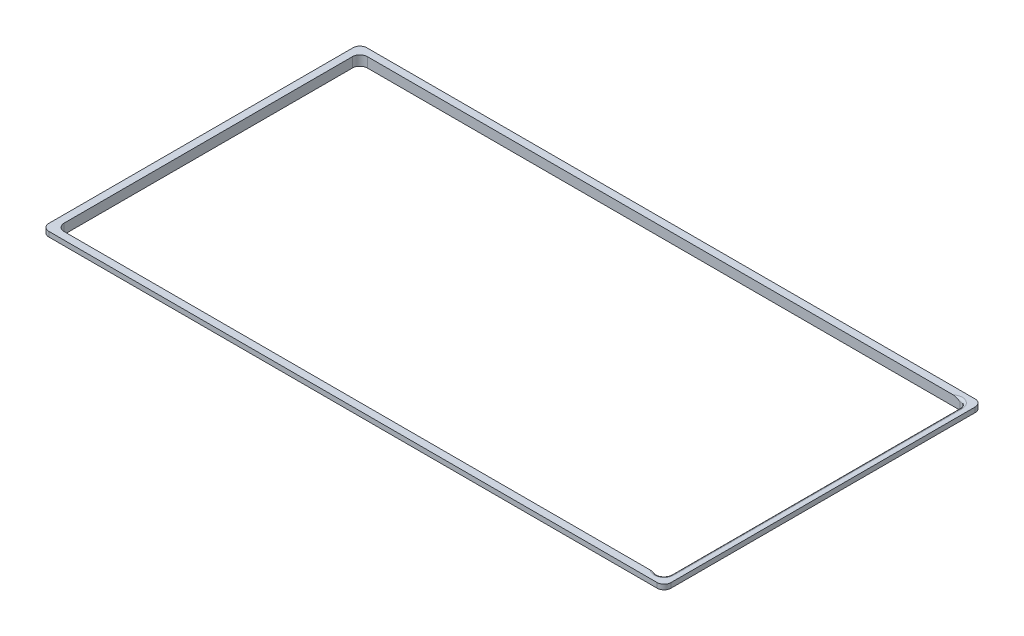
ISO-10303-21;
HEADER;
FILE_DESCRIPTION(('STEP AP214'),'2;1');
FILE_NAME('part.step','',(''),(''),'','','');
FILE_SCHEMA(('AUTOMOTIVE_DESIGN { 1 0 10303 214 1 1 1 1 }'));
ENDSEC;
DATA;
#1=APPLICATION_CONTEXT('core data for automotive mechanical design processes');
#2=APPLICATION_PROTOCOL_DEFINITION('international standard','automotive_design',2000,#1);
#3=PRODUCT_CONTEXT('',#1,'mechanical');
#4=PRODUCT('Part','Part','',(#3));
#5=PRODUCT_RELATED_PRODUCT_CATEGORY('part','',(#4));
#6=PRODUCT_DEFINITION_FORMATION('','',#4);
#7=PRODUCT_DEFINITION_CONTEXT('part definition',#1,'design');
#8=PRODUCT_DEFINITION('design','',#6,#7);
#9=PRODUCT_DEFINITION_SHAPE('','',#8);
#10=(LENGTH_UNIT() NAMED_UNIT(*) SI_UNIT(.MILLI.,.METRE.));
#11=(NAMED_UNIT(*) PLANE_ANGLE_UNIT() SI_UNIT($,.RADIAN.));
#12=(NAMED_UNIT(*) SI_UNIT($,.STERADIAN.) SOLID_ANGLE_UNIT());
#13=UNCERTAINTY_MEASURE_WITH_UNIT(LENGTH_MEASURE(1.E-05),#10,'distance_accuracy_value','');
#14=(GEOMETRIC_REPRESENTATION_CONTEXT(3) GLOBAL_UNCERTAINTY_ASSIGNED_CONTEXT((#13)) GLOBAL_UNIT_ASSIGNED_CONTEXT((#10,
#11,#12)) REPRESENTATION_CONTEXT('',''));
#15=CARTESIAN_POINT('',(0.,0.,0.));
#16=DIRECTION('',(0.,0.,1.));
#17=DIRECTION('',(1.,0.,0.));
#18=AXIS2_PLACEMENT_3D('',#15,#16,#17);
#19=CARTESIAN_POINT('',(249.,0.,3.));
#20=DIRECTION('',(0.,-1.,0.));
#21=DIRECTION('',(0.,0.,-1.));
#22=AXIS2_PLACEMENT_3D('',#19,#20,#21);
#23=PLANE('',#22);
#24=DIRECTION('',(0.,0.,-1.));
#25=VECTOR('',#24,1.);
#26=CARTESIAN_POINT('',(2.2,0.,6.2));
#27=LINE('',#26,#25);
#28=CARTESIAN_POINT('',(2.2,0.,122.8));
#29=VERTEX_POINT('',#28);
#30=CARTESIAN_POINT('',(2.19999999999998,0.,6.2));
#31=VERTEX_POINT('',#30);
#32=EDGE_CURVE('E335',#29,#31,#27,.T.);
#33=ORIENTED_EDGE('',*,*,#32,.F.);
#34=CARTESIAN_POINT('',(6.20000000000001,0.,122.8));
#35=DIRECTION('',(0.,-1.,0.));
#36=DIRECTION('',(0.,0.,-1.));
#37=AXIS2_PLACEMENT_3D('',#34,#35,#36);
#38=CIRCLE('',#37,4.00000000000001);
#39=CARTESIAN_POINT('',(6.20000000000001,0.,126.8));
#40=VERTEX_POINT('',#39);
#41=EDGE_CURVE('E313',#40,#29,#38,.T.);
#42=ORIENTED_EDGE('',*,*,#41,.F.);
#43=DIRECTION('',(-1.,0.,0.));
#44=VECTOR('',#43,1.);
#45=CARTESIAN_POINT('',(6.20000000000001,0.,126.8));
#46=LINE('',#45,#44);
#47=CARTESIAN_POINT('',(245.8,0.,126.8));
#48=VERTEX_POINT('',#47);
#49=EDGE_CURVE('E318',#48,#40,#46,.T.);
#50=ORIENTED_EDGE('',*,*,#49,.F.);
#51=CARTESIAN_POINT('',(245.8,0.,122.8));
#52=DIRECTION('',(0.,-1.,0.));
#53=DIRECTION('',(0.,0.,-1.));
#54=AXIS2_PLACEMENT_3D('',#51,#52,#53);
#55=CIRCLE('',#54,4.);
#56=CARTESIAN_POINT('',(249.8,0.,122.8));
#57=VERTEX_POINT('',#56);
#58=EDGE_CURVE('E345',#57,#48,#55,.T.);
#59=ORIENTED_EDGE('',*,*,#58,.F.);
#60=DIRECTION('',(0.,0.,1.));
#61=VECTOR('',#60,1.);
#62=CARTESIAN_POINT('',(249.8,0.,122.8));
#63=LINE('',#62,#61);
#64=CARTESIAN_POINT('',(249.8,0.,6.2));
#65=VERTEX_POINT('',#64);
#66=EDGE_CURVE('E343',#65,#57,#63,.T.);
#67=ORIENTED_EDGE('',*,*,#66,.F.);
#68=CARTESIAN_POINT('',(245.8,0.,6.2));
#69=DIRECTION('',(0.,-1.,0.));
#70=DIRECTION('',(0.,0.,-1.));
#71=AXIS2_PLACEMENT_3D('',#68,#69,#70);
#72=CIRCLE('',#71,4.00000000000003);
#73=CARTESIAN_POINT('',(245.8,0.,2.19999999999997));
#74=VERTEX_POINT('',#73);
#75=EDGE_CURVE('E341',#74,#65,#72,.T.);
#76=ORIENTED_EDGE('',*,*,#75,.F.);
#77=DIRECTION('',(1.,0.,0.));
#78=VECTOR('',#77,1.);
#79=CARTESIAN_POINT('',(245.8,0.,2.2));
#80=LINE('',#79,#78);
#81=CARTESIAN_POINT('',(6.20000000000001,0.,2.19999999999996));
#82=VERTEX_POINT('',#81);
#83=EDGE_CURVE('E339',#82,#74,#80,.T.);
#84=ORIENTED_EDGE('',*,*,#83,.F.);
#85=CARTESIAN_POINT('',(6.2,0.,6.2));
#86=DIRECTION('',(0.,-1.,0.));
#87=DIRECTION('',(0.,0.,-1.));
#88=AXIS2_PLACEMENT_3D('',#85,#86,#87);
#89=CIRCLE('',#88,4.00000000000002);
#90=EDGE_CURVE('E337',#31,#82,#89,.T.);
#91=ORIENTED_EDGE('',*,*,#90,.F.);
#92=EDGE_LOOP('',(#33,#42,#50,#59,#67,#76,#84,#91));
#93=FACE_BOUND('',#92,.T.);
#94=DIRECTION('',(1.,0.,0.));
#95=VECTOR('',#94,1.);
#96=CARTESIAN_POINT('',(249.,0.,0.2));
#97=LINE('',#96,#95);
#98=CARTESIAN_POINT('',(3.00000000000003,0.,0.2));
#99=VERTEX_POINT('',#98);
#100=CARTESIAN_POINT('',(249.,0.,0.2));
#101=VERTEX_POINT('',#100);
#102=EDGE_CURVE('E259',#99,#101,#97,.T.);
#103=ORIENTED_EDGE('',*,*,#102,.T.);
#104=CARTESIAN_POINT('',(249.,0.,3.));
#105=DIRECTION('',(0.,-1.,0.));
#106=DIRECTION('',(0.,0.,-1.));
#107=AXIS2_PLACEMENT_3D('',#104,#105,#106);
#108=CIRCLE('',#107,2.80000000000001);
#109=CARTESIAN_POINT('',(251.8,0.,3.00000000000002));
#110=VERTEX_POINT('',#109);
#111=EDGE_CURVE('E286',#101,#110,#108,.T.);
#112=ORIENTED_EDGE('',*,*,#111,.T.);
#113=DIRECTION('',(0.,0.,1.));
#114=VECTOR('',#113,1.);
#115=CARTESIAN_POINT('',(251.8,0.,3.));
#116=LINE('',#115,#114);
#117=CARTESIAN_POINT('',(251.8,0.,126.));
#118=VERTEX_POINT('',#117);
#119=EDGE_CURVE('E283',#110,#118,#116,.T.);
#120=ORIENTED_EDGE('',*,*,#119,.T.);
#121=CARTESIAN_POINT('',(249.,0.,126.));
#122=DIRECTION('',(0.,-1.,0.));
#123=DIRECTION('',(0.,0.,-1.));
#124=AXIS2_PLACEMENT_3D('',#121,#122,#123);
#125=CIRCLE('',#124,2.80000000000001);
#126=CARTESIAN_POINT('',(249.,0.,128.8));
#127=VERTEX_POINT('',#126);
#128=EDGE_CURVE('E280',#118,#127,#125,.T.);
#129=ORIENTED_EDGE('',*,*,#128,.T.);
#130=DIRECTION('',(-1.,0.,0.));
#131=VECTOR('',#130,1.);
#132=CARTESIAN_POINT('',(249.,0.,128.8));
#133=LINE('',#132,#131);
#134=CARTESIAN_POINT('',(3.00000000000002,0.,128.8));
#135=VERTEX_POINT('',#134);
#136=EDGE_CURVE('E277',#127,#135,#133,.T.);
#137=ORIENTED_EDGE('',*,*,#136,.T.);
#138=CARTESIAN_POINT('',(3.00000000000002,0.,126.));
#139=DIRECTION('',(0.,-1.,0.));
#140=DIRECTION('',(0.,0.,-1.));
#141=AXIS2_PLACEMENT_3D('',#138,#139,#140);
#142=CIRCLE('',#141,2.80000000000001);
#143=CARTESIAN_POINT('',(0.2,0.,126.));
#144=VERTEX_POINT('',#143);
#145=EDGE_CURVE('E274',#135,#144,#142,.T.);
#146=ORIENTED_EDGE('',*,*,#145,.T.);
#147=DIRECTION('',(0.,0.,-1.));
#148=VECTOR('',#147,1.);
#149=CARTESIAN_POINT('',(0.200000000000006,0.,3.));
#150=LINE('',#149,#148);
#151=CARTESIAN_POINT('',(0.2,0.,3.00000000000002));
#152=VERTEX_POINT('',#151);
#153=EDGE_CURVE('E272',#144,#152,#150,.T.);
#154=ORIENTED_EDGE('',*,*,#153,.T.);
#155=CARTESIAN_POINT('',(3.,0.,3.));
#156=DIRECTION('',(0.,-1.,0.));
#157=DIRECTION('',(0.,0.,-1.));
#158=AXIS2_PLACEMENT_3D('',#155,#156,#157);
#159=CIRCLE('',#158,2.8);
#160=EDGE_CURVE('E221',#152,#99,#159,.T.);
#161=ORIENTED_EDGE('',*,*,#160,.T.);
#162=EDGE_LOOP('',(#103,#112,#120,#129,#137,#146,#154,#161));
#163=FACE_BOUND('',#162,.T.);
#164=ADVANCED_FACE('F39',(#93,#163),#23,.T.);
#165=CARTESIAN_POINT('',(249.,2.,3.));
#166=DIRECTION('',(0.,-1.,0.));
#167=DIRECTION('',(0.,0.,-1.));
#168=AXIS2_PLACEMENT_3D('',#165,#166,#167);
#169=PLANE('',#168);
#170=DIRECTION('',(-1.,0.,0.));
#171=VECTOR('',#170,1.);
#172=CARTESIAN_POINT('',(6.2,2.,3.2));
#173=LINE('',#172,#171);
#174=CARTESIAN_POINT('',(243.154248688935,2.,3.2));
#175=VERTEX_POINT('',#174);
#176=CARTESIAN_POINT('',(6.2,2.,3.2));
#177=VERTEX_POINT('',#176);
#178=EDGE_CURVE('E370',#175,#177,#173,.T.);
#179=ORIENTED_EDGE('',*,*,#178,.F.);
#180=CARTESIAN_POINT('',(245.8,2.,6.2));
#181=DIRECTION('',(0.,-1.,0.));
#182=DIRECTION('',(0.,0.,-1.));
#183=AXIS2_PLACEMENT_3D('',#180,#181,#182);
#184=CIRCLE('',#183,4.);
#185=CARTESIAN_POINT('',(249.8,2.,6.2));
#186=VERTEX_POINT('',#185);
#187=EDGE_CURVE('E516',#175,#186,#184,.T.);
#188=ORIENTED_EDGE('',*,*,#187,.T.);
#189=DIRECTION('',(0.,0.,-1.));
#190=VECTOR('',#189,1.);
#191=CARTESIAN_POINT('',(249.8,2.,122.8));
#192=LINE('',#191,#190);
#193=CARTESIAN_POINT('',(249.8,2.,122.8));
#194=VERTEX_POINT('',#193);
#195=EDGE_CURVE('E407',#186,#194,#192,.F.);
#196=ORIENTED_EDGE('',*,*,#195,.T.);
#197=CARTESIAN_POINT('',(245.8,2.,122.8));
#198=DIRECTION('',(0.,-1.,0.));
#199=DIRECTION('',(0.,0.,-1.));
#200=AXIS2_PLACEMENT_3D('',#197,#198,#199);
#201=CIRCLE('',#200,4.00000000000002);
#202=CARTESIAN_POINT('',(243.154248688935,2.,125.8));
#203=VERTEX_POINT('',#202);
#204=EDGE_CURVE('E517',#194,#203,#201,.T.);
#205=ORIENTED_EDGE('',*,*,#204,.T.);
#206=DIRECTION('',(1.,0.,0.));
#207=VECTOR('',#206,1.);
#208=CARTESIAN_POINT('',(6.20000000000001,2.,125.8));
#209=LINE('',#208,#207);
#210=CARTESIAN_POINT('',(6.20000000000001,2.,125.8));
#211=VERTEX_POINT('',#210);
#212=EDGE_CURVE('E378',#211,#203,#209,.T.);
#213=ORIENTED_EDGE('',*,*,#212,.F.);
#214=CARTESIAN_POINT('',(6.20000000000001,2.,122.8));
#215=DIRECTION('',(0.,1.,0.));
#216=DIRECTION('',(0.,0.,-1.));
#217=AXIS2_PLACEMENT_3D('',#214,#215,#216);
#218=CIRCLE('',#217,3.);
#219=CARTESIAN_POINT('',(3.20000000000001,2.,122.8));
#220=VERTEX_POINT('',#219);
#221=EDGE_CURVE('E376',#220,#211,#218,.T.);
#222=ORIENTED_EDGE('',*,*,#221,.F.);
#223=DIRECTION('',(0.,0.,1.));
#224=VECTOR('',#223,1.);
#225=CARTESIAN_POINT('',(3.2,2.,6.2));
#226=LINE('',#225,#224);
#227=CARTESIAN_POINT('',(3.2,2.,6.2));
#228=VERTEX_POINT('',#227);
#229=EDGE_CURVE('E374',#228,#220,#226,.T.);
#230=ORIENTED_EDGE('',*,*,#229,.F.);
#231=CARTESIAN_POINT('',(6.2,2.,6.2));
#232=DIRECTION('',(0.,1.,0.));
#233=DIRECTION('',(0.,0.,1.));
#234=AXIS2_PLACEMENT_3D('',#231,#232,#233);
#235=CIRCLE('',#234,3.);
#236=EDGE_CURVE('E372',#177,#228,#235,.T.);
#237=ORIENTED_EDGE('',*,*,#236,.F.);
#238=EDGE_LOOP('',(#179,#188,#196,#205,#213,#222,#230,#237));
#239=FACE_BOUND('',#238,.T.);
#240=CARTESIAN_POINT('',(249.,2.,3.));
#241=DIRECTION('',(0.,1.,0.));
#242=DIRECTION('',(0.,0.,1.));
#243=AXIS2_PLACEMENT_3D('',#240,#241,#242);
#244=CIRCLE('',#243,2.80000000000001);
#245=CARTESIAN_POINT('',(251.8,2.,3.00000000000002));
#246=VERTEX_POINT('',#245);
#247=CARTESIAN_POINT('',(249.,2.,0.2));
#248=VERTEX_POINT('',#247);
#249=EDGE_CURVE('E242',#246,#248,#244,.T.);
#250=ORIENTED_EDGE('',*,*,#249,.T.);
#251=DIRECTION('',(-1.,0.,0.));
#252=VECTOR('',#251,1.);
#253=CARTESIAN_POINT('',(249.,2.,0.2));
#254=LINE('',#253,#252);
#255=CARTESIAN_POINT('',(3.00000000000003,2.,0.2));
#256=VERTEX_POINT('',#255);
#257=EDGE_CURVE('E240',#248,#256,#254,.T.);
#258=ORIENTED_EDGE('',*,*,#257,.T.);
#259=CARTESIAN_POINT('',(3.,2.,3.));
#260=DIRECTION('',(0.,1.,0.));
#261=DIRECTION('',(0.,0.,1.));
#262=AXIS2_PLACEMENT_3D('',#259,#260,#261);
#263=CIRCLE('',#262,2.8);
#264=CARTESIAN_POINT('',(0.2,2.,3.00000000000002));
#265=VERTEX_POINT('',#264);
#266=EDGE_CURVE('E218',#256,#265,#263,.T.);
#267=ORIENTED_EDGE('',*,*,#266,.T.);
#268=DIRECTION('',(0.,0.,1.));
#269=VECTOR('',#268,1.);
#270=CARTESIAN_POINT('',(0.200000000000001,2.,3.00000000000002));
#271=LINE('',#270,#269);
#272=CARTESIAN_POINT('',(0.2,2.,126.));
#273=VERTEX_POINT('',#272);
#274=EDGE_CURVE('E228',#265,#273,#271,.T.);
#275=ORIENTED_EDGE('',*,*,#274,.T.);
#276=CARTESIAN_POINT('',(3.00000000000002,2.,126.));
#277=DIRECTION('',(0.,1.,0.));
#278=DIRECTION('',(0.,0.,1.));
#279=AXIS2_PLACEMENT_3D('',#276,#277,#278);
#280=CIRCLE('',#279,2.80000000000001);
#281=CARTESIAN_POINT('',(3.00000000000002,2.,128.8));
#282=VERTEX_POINT('',#281);
#283=EDGE_CURVE('E234',#273,#282,#280,.T.);
#284=ORIENTED_EDGE('',*,*,#283,.T.);
#285=DIRECTION('',(1.,0.,0.));
#286=VECTOR('',#285,1.);
#287=CARTESIAN_POINT('',(3.00000000000001,2.,128.8));
#288=LINE('',#287,#286);
#289=CARTESIAN_POINT('',(249.,2.,128.8));
#290=VERTEX_POINT('',#289);
#291=EDGE_CURVE('E247',#282,#290,#288,.T.);
#292=ORIENTED_EDGE('',*,*,#291,.T.);
#293=CARTESIAN_POINT('',(249.,2.,126.));
#294=DIRECTION('',(0.,1.,0.));
#295=DIRECTION('',(0.,0.,1.));
#296=AXIS2_PLACEMENT_3D('',#293,#294,#295);
#297=CIRCLE('',#296,2.80000000000001);
#298=CARTESIAN_POINT('',(251.8,2.,126.));
#299=VERTEX_POINT('',#298);
#300=EDGE_CURVE('E250',#290,#299,#297,.T.);
#301=ORIENTED_EDGE('',*,*,#300,.T.);
#302=DIRECTION('',(0.,0.,-1.));
#303=VECTOR('',#302,1.);
#304=CARTESIAN_POINT('',(251.8,2.,126.));
#305=LINE('',#304,#303);
#306=EDGE_CURVE('E253',#299,#246,#305,.T.);
#307=ORIENTED_EDGE('',*,*,#306,.T.);
#308=EDGE_LOOP('',(#250,#258,#267,#275,#284,#292,#301,#307));
#309=FACE_BOUND('',#308,.T.);
#310=ADVANCED_FACE('F238',(#239,#309),#169,.F.);
#311=CARTESIAN_POINT('',(245.8,2.,6.2));
#312=DIRECTION('',(0.,-1.,0.));
#313=DIRECTION('',(0.,0.,-1.));
#314=AXIS2_PLACEMENT_3D('',#311,#312,#313);
#315=CYLINDRICAL_SURFACE('',#314,3.);
#316=DIRECTION('',(0.,-1.,0.));
#317=VECTOR('',#316,1.);
#318=CARTESIAN_POINT('',(248.8,2.,6.2));
#319=LINE('',#318,#317);
#320=CARTESIAN_POINT('',(248.8,1.,6.2));
#321=VERTEX_POINT('',#320);
#322=CARTESIAN_POINT('',(248.8,-2.,6.2));
#323=VERTEX_POINT('',#322);
#324=EDGE_CURVE('E380',#321,#323,#319,.T.);
#325=ORIENTED_EDGE('',*,*,#324,.F.);
#326=CARTESIAN_POINT('',(245.8,1.,6.2));
#327=DIRECTION('',(0.,-1.,0.));
#328=DIRECTION('',(0.,0.,-1.));
#329=AXIS2_PLACEMENT_3D('',#326,#327,#328);
#330=CIRCLE('',#329,3.);
#331=CARTESIAN_POINT('',(245.8,1.,3.2));
#332=VERTEX_POINT('',#331);
#333=EDGE_CURVE('E396',#321,#332,#330,.F.);
#334=ORIENTED_EDGE('',*,*,#333,.T.);
#335=DIRECTION('',(0.,-1.,0.));
#336=VECTOR('',#335,1.);
#337=CARTESIAN_POINT('',(245.8,2.,3.2));
#338=LINE('',#337,#336);
#339=CARTESIAN_POINT('',(245.8,-2.,3.2));
#340=VERTEX_POINT('',#339);
#341=EDGE_CURVE('E394',#332,#340,#338,.T.);
#342=ORIENTED_EDGE('',*,*,#341,.T.);
#343=CARTESIAN_POINT('',(245.8,-2.,6.2));
#344=DIRECTION('',(0.,-1.,0.));
#345=DIRECTION('',(0.,0.,-1.));
#346=AXIS2_PLACEMENT_3D('',#343,#344,#345);
#347=CIRCLE('',#346,3.);
#348=EDGE_CURVE('E307',#340,#323,#347,.T.);
#349=ORIENTED_EDGE('',*,*,#348,.T.);
#350=EDGE_LOOP('',(#325,#334,#342,#349));
#351=FACE_BOUND('',#350,.T.);
#352=ADVANCED_FACE('F418',(#351),#315,.F.);
#353=CARTESIAN_POINT('',(6.2,2.,3.2));
#354=DIRECTION('',(0.,0.,1.));
#355=DIRECTION('',(1.,0.,0.));
#356=AXIS2_PLACEMENT_3D('',#353,#354,#355);
#357=PLANE('',#356);
#358=ORIENTED_EDGE('',*,*,#341,.F.);
#359=CARTESIAN_POINT('',(243.154248688935,2.,3.2));
#360=CARTESIAN_POINT('',(243.229838055169,1.99998056944619,3.2));
#361=CARTESIAN_POINT('',(243.305324759837,1.99625474070306,3.2));
#362=CARTESIAN_POINT('',(243.455551913194,1.98235127968281,3.2));
#363=CARTESIAN_POINT('',(243.530293612384,1.97218745926706,3.2));
#364=CARTESIAN_POINT('',(243.750920038087,1.93382268301607,3.2));
#365=CARTESIAN_POINT('',(243.895419127168,1.89769044288574,3.2));
#366=CARTESIAN_POINT('',(244.192257965878,1.80602822582356,3.2));
#367=CARTESIAN_POINT('',(244.344123020857,1.74903813086173,3.2));
#368=CARTESIAN_POINT('',(244.642610574791,1.62253993387655,3.2));
#369=CARTESIAN_POINT('',(244.78922683472,1.55301749103933,3.2));
#370=CARTESIAN_POINT('',(245.224920399901,1.33195362115618,3.2));
#371=CARTESIAN_POINT('',(245.50785237038,1.16867076080264,3.20000000000001));
#372=CARTESIAN_POINT('',(245.793675467035,1.00365145152839,3.2));
#373=CARTESIAN_POINT('',(245.796837744966,1.00182570919886,3.2));
#374=CARTESIAN_POINT('',(245.8,1.,3.2));
#375=B_SPLINE_CURVE_WITH_KNOTS('',3,(#359,#360,#361,#362,#363,#364,#365,#366,#367,#368,#369,
#370,#371,#372,#373,#374),.UNSPECIFIED.,.F.,.F.,(4,2,2,2,2,2,2,4),(0.,0.226523097183641,
0.452561857357622,0.898071970071568,1.38391997806556,1.87032751436373,2.84948260162621,
2.86043705277646),.UNSPECIFIED.);
#376=EDGE_CURVE('E399',#332,#175,#375,.F.);
#377=ORIENTED_EDGE('',*,*,#376,.T.);
#378=ORIENTED_EDGE('',*,*,#178,.T.);
#379=DIRECTION('',(0.,-1.,0.));
#380=VECTOR('',#379,1.);
#381=CARTESIAN_POINT('',(6.2,2.,3.2));
#382=LINE('',#381,#380);
#383=CARTESIAN_POINT('',(6.2,-2.,3.2));
#384=VERTEX_POINT('',#383);
#385=EDGE_CURVE('E392',#177,#384,#382,.T.);
#386=ORIENTED_EDGE('',*,*,#385,.T.);
#387=DIRECTION('',(1.,0.,0.));
#388=VECTOR('',#387,1.);
#389=CARTESIAN_POINT('',(245.8,-2.,3.2));
#390=LINE('',#389,#388);
#391=EDGE_CURVE('E304',#384,#340,#390,.T.);
#392=ORIENTED_EDGE('',*,*,#391,.T.);
#393=EDGE_LOOP('',(#358,#377,#378,#386,#392));
#394=FACE_BOUND('',#393,.T.);
#395=ADVANCED_FACE('F412',(#394),#357,.T.);
#396=CARTESIAN_POINT('',(6.2,2.,6.2));
#397=DIRECTION('',(0.,-1.,0.));
#398=DIRECTION('',(0.,0.,-1.));
#399=AXIS2_PLACEMENT_3D('',#396,#397,#398);
#400=CYLINDRICAL_SURFACE('',#399,3.);
#401=DIRECTION('',(0.,-1.,0.));
#402=VECTOR('',#401,1.);
#403=CARTESIAN_POINT('',(3.2,2.,6.2));
#404=LINE('',#403,#402);
#405=CARTESIAN_POINT('',(3.2,-2.,6.2));
#406=VERTEX_POINT('',#405);
#407=EDGE_CURVE('E390',#228,#406,#404,.T.);
#408=ORIENTED_EDGE('',*,*,#407,.T.);
#409=CARTESIAN_POINT('',(6.2,-2.,6.2));
#410=DIRECTION('',(0.,-1.,0.));
#411=DIRECTION('',(0.,0.,-1.));
#412=AXIS2_PLACEMENT_3D('',#409,#410,#411);
#413=CIRCLE('',#412,3.);
#414=EDGE_CURVE('E301',#406,#384,#413,.T.);
#415=ORIENTED_EDGE('',*,*,#414,.T.);
#416=ORIENTED_EDGE('',*,*,#385,.F.);
#417=ORIENTED_EDGE('',*,*,#236,.T.);
#418=EDGE_LOOP('',(#408,#415,#416,#417));
#419=FACE_BOUND('',#418,.T.);
#420=ADVANCED_FACE('F417',(#419),#400,.F.);
#421=CARTESIAN_POINT('',(3.2,2.,6.2));
#422=DIRECTION('',(1.,0.,0.));
#423=DIRECTION('',(0.,0.,-1.));
#424=AXIS2_PLACEMENT_3D('',#421,#422,#423);
#425=PLANE('',#424);
#426=DIRECTION('',(0.,-1.,0.));
#427=VECTOR('',#426,1.);
#428=CARTESIAN_POINT('',(3.20000000000001,2.,122.8));
#429=LINE('',#428,#427);
#430=CARTESIAN_POINT('',(3.20000000000001,-2.,122.8));
#431=VERTEX_POINT('',#430);
#432=EDGE_CURVE('E388',#220,#431,#429,.T.);
#433=ORIENTED_EDGE('',*,*,#432,.T.);
#434=DIRECTION('',(0.,0.,-1.));
#435=VECTOR('',#434,1.);
#436=CARTESIAN_POINT('',(3.2,-2.,6.2));
#437=LINE('',#436,#435);
#438=EDGE_CURVE('E298',#431,#406,#437,.T.);
#439=ORIENTED_EDGE('',*,*,#438,.T.);
#440=ORIENTED_EDGE('',*,*,#407,.F.);
#441=ORIENTED_EDGE('',*,*,#229,.T.);
#442=EDGE_LOOP('',(#433,#439,#440,#441));
#443=FACE_BOUND('',#442,.T.);
#444=ADVANCED_FACE('F485',(#443),#425,.T.);
#445=CARTESIAN_POINT('',(6.20000000000001,2.,122.8));
#446=DIRECTION('',(0.,-1.,0.));
#447=DIRECTION('',(0.,0.,-1.));
#448=AXIS2_PLACEMENT_3D('',#445,#446,#447);
#449=CYLINDRICAL_SURFACE('',#448,3.);
#450=DIRECTION('',(0.,-1.,0.));
#451=VECTOR('',#450,1.);
#452=CARTESIAN_POINT('',(6.20000000000001,2.,125.8));
#453=LINE('',#452,#451);
#454=CARTESIAN_POINT('',(6.20000000000001,-2.,125.8));
#455=VERTEX_POINT('',#454);
#456=EDGE_CURVE('E386',#211,#455,#453,.T.);
#457=ORIENTED_EDGE('',*,*,#456,.T.);
#458=CARTESIAN_POINT('',(6.20000000000001,-2.,122.8));
#459=DIRECTION('',(0.,-1.,0.));
#460=DIRECTION('',(0.,0.,-1.));
#461=AXIS2_PLACEMENT_3D('',#458,#459,#460);
#462=CIRCLE('',#461,3.);
#463=EDGE_CURVE('E295',#455,#431,#462,.T.);
#464=ORIENTED_EDGE('',*,*,#463,.T.);
#465=ORIENTED_EDGE('',*,*,#432,.F.);
#466=ORIENTED_EDGE('',*,*,#221,.T.);
#467=EDGE_LOOP('',(#457,#464,#465,#466));
#468=FACE_BOUND('',#467,.T.);
#469=ADVANCED_FACE('F482',(#468),#449,.F.);
#470=CARTESIAN_POINT('',(6.20000000000001,2.,125.8));
#471=DIRECTION('',(0.,0.,-1.));
#472=DIRECTION('',(-1.,0.,0.));
#473=AXIS2_PLACEMENT_3D('',#470,#471,#472);
#474=PLANE('',#473);
#475=ORIENTED_EDGE('',*,*,#212,.T.);
#476=CARTESIAN_POINT('',(243.154248688935,2.,125.8));
#477=CARTESIAN_POINT('',(243.22983805517,1.99998056944622,125.8));
#478=CARTESIAN_POINT('',(243.305324759839,1.99625474070298,125.8));
#479=CARTESIAN_POINT('',(243.455551913198,1.98235127968237,125.8));
#480=CARTESIAN_POINT('',(243.530293612388,1.9721874592664,125.8));
#481=CARTESIAN_POINT('',(243.75092003809,1.93382268301529,125.8));
#482=CARTESIAN_POINT('',(243.89541912717,1.89769044288551,125.8));
#483=CARTESIAN_POINT('',(244.192257965877,1.80602822582334,125.8));
#484=CARTESIAN_POINT('',(244.344123020856,1.74903813086072,125.8));
#485=CARTESIAN_POINT('',(244.64261057479,1.62253993387839,125.8));
#486=CARTESIAN_POINT('',(244.789226834721,1.55301749104486,125.8));
#487=CARTESIAN_POINT('',(245.224920399894,1.33195362114816,125.8));
#488=CARTESIAN_POINT('',(245.50785237035,1.16867076075337,125.8));
#489=CARTESIAN_POINT('',(245.793675467034,1.00365145152726,125.8));
#490=CARTESIAN_POINT('',(245.796837744966,1.00182570919828,125.8));
#491=CARTESIAN_POINT('',(245.8,1.,125.8));
#492=B_SPLINE_CURVE_WITH_KNOTS('',3,(#476,#477,#478,#479,#480,#481,#482,#483,#484,#485,#486,
#487,#488,#489,#490,#491),.UNSPECIFIED.,.F.,.F.,(4,2,2,2,2,2,2,4),(0.,0.226523097186592,
0.452561857362801,0.898071970071575,1.38391997806476,1.87032751436056,2.84948260162628,
2.86043705277645),.UNSPECIFIED.);
#493=CARTESIAN_POINT('',(245.8,1.,125.8));
#494=VERTEX_POINT('',#493);
#495=EDGE_CURVE('E49',#203,#494,#492,.T.);
#496=ORIENTED_EDGE('',*,*,#495,.T.);
#497=DIRECTION('',(0.,-1.,0.));
#498=VECTOR('',#497,1.);
#499=CARTESIAN_POINT('',(245.8,2.,125.8));
#500=LINE('',#499,#498);
#501=CARTESIAN_POINT('',(245.8,-2.,125.8));
#502=VERTEX_POINT('',#501);
#503=EDGE_CURVE('E384',#494,#502,#500,.T.);
#504=ORIENTED_EDGE('',*,*,#503,.T.);
#505=DIRECTION('',(-1.,0.,0.));
#506=VECTOR('',#505,1.);
#507=CARTESIAN_POINT('',(6.20000000000001,-2.,125.8));
#508=LINE('',#507,#506);
#509=EDGE_CURVE('E292',#502,#455,#508,.T.);
#510=ORIENTED_EDGE('',*,*,#509,.T.);
#511=ORIENTED_EDGE('',*,*,#456,.F.);
#512=EDGE_LOOP('',(#475,#496,#504,#510,#511));
#513=FACE_BOUND('',#512,.T.);
#514=ADVANCED_FACE('F476',(#513),#474,.T.);
#515=CARTESIAN_POINT('',(245.8,2.,122.8));
#516=DIRECTION('',(0.,-1.,0.));
#517=DIRECTION('',(0.,0.,-1.));
#518=AXIS2_PLACEMENT_3D('',#515,#516,#517);
#519=CYLINDRICAL_SURFACE('',#518,3.00000000000002);
#520=ORIENTED_EDGE('',*,*,#503,.F.);
#521=CARTESIAN_POINT('',(245.8,1.,122.8));
#522=DIRECTION('',(0.,-1.,0.));
#523=DIRECTION('',(0.,0.,-1.));
#524=AXIS2_PLACEMENT_3D('',#521,#522,#523);
#525=CIRCLE('',#524,3.00000000000002);
#526=CARTESIAN_POINT('',(248.8,1.,122.8));
#527=VERTEX_POINT('',#526);
#528=EDGE_CURVE('E63',#494,#527,#525,.F.);
#529=ORIENTED_EDGE('',*,*,#528,.T.);
#530=DIRECTION('',(0.,-1.,0.));
#531=VECTOR('',#530,1.);
#532=CARTESIAN_POINT('',(248.8,2.,122.8));
#533=LINE('',#532,#531);
#534=CARTESIAN_POINT('',(248.8,-2.,122.8));
#535=VERTEX_POINT('',#534);
#536=EDGE_CURVE('E382',#527,#535,#533,.T.);
#537=ORIENTED_EDGE('',*,*,#536,.T.);
#538=CARTESIAN_POINT('',(245.8,-2.,122.8));
#539=DIRECTION('',(0.,-1.,0.));
#540=DIRECTION('',(0.,0.,-1.));
#541=AXIS2_PLACEMENT_3D('',#538,#539,#540);
#542=CIRCLE('',#541,3.);
#543=EDGE_CURVE('E289',#535,#502,#542,.T.);
#544=ORIENTED_EDGE('',*,*,#543,.T.);
#545=EDGE_LOOP('',(#520,#529,#537,#544));
#546=FACE_BOUND('',#545,.T.);
#547=ADVANCED_FACE('F481',(#546),#519,.F.);
#548=CARTESIAN_POINT('',(248.8,2.,6.2));
#549=DIRECTION('',(-1.,0.,0.));
#550=DIRECTION('',(0.,0.,1.));
#551=AXIS2_PLACEMENT_3D('',#548,#549,#550);
#552=PLANE('',#551);
#553=ORIENTED_EDGE('',*,*,#536,.F.);
#554=DIRECTION('',(0.,0.,-1.));
#555=VECTOR('',#554,1.);
#556=CARTESIAN_POINT('',(248.8,1.,6.2));
#557=LINE('',#556,#555);
#558=EDGE_CURVE('E11',#527,#321,#557,.T.);
#559=ORIENTED_EDGE('',*,*,#558,.T.);
#560=ORIENTED_EDGE('',*,*,#324,.T.);
#561=DIRECTION('',(0.,0.,1.));
#562=VECTOR('',#561,1.);
#563=CARTESIAN_POINT('',(248.8,-2.,122.8));
#564=LINE('',#563,#562);
#565=EDGE_CURVE('E310',#323,#535,#564,.T.);
#566=ORIENTED_EDGE('',*,*,#565,.T.);
#567=EDGE_LOOP('',(#553,#559,#560,#566));
#568=FACE_BOUND('',#567,.T.);
#569=ADVANCED_FACE('F513',(#568),#552,.T.);
#570=CARTESIAN_POINT('',(6.20000000000001,-2.,122.8));
#571=DIRECTION('',(0.,-1.,0.));
#572=DIRECTION('',(0.,0.,-1.));
#573=AXIS2_PLACEMENT_3D('',#570,#571,#572);
#574=PLANE('',#573);
#575=CARTESIAN_POINT('',(6.20000000000001,-2.,122.8));
#576=DIRECTION('',(0.,-1.,0.));
#577=DIRECTION('',(0.,0.,-1.));
#578=AXIS2_PLACEMENT_3D('',#575,#576,#577);
#579=CIRCLE('',#578,4.00000000000001);
#580=CARTESIAN_POINT('',(6.20000000000001,-2.,126.8));
#581=VERTEX_POINT('',#580);
#582=CARTESIAN_POINT('',(2.2,-2.,122.8));
#583=VERTEX_POINT('',#582);
#584=EDGE_CURVE('E314',#581,#583,#579,.T.);
#585=ORIENTED_EDGE('',*,*,#584,.T.);
#586=DIRECTION('',(0.,0.,-1.));
#587=VECTOR('',#586,1.);
#588=CARTESIAN_POINT('',(2.2,-2.,6.2));
#589=LINE('',#588,#587);
#590=CARTESIAN_POINT('',(2.19999999999998,-2.,6.2));
#591=VERTEX_POINT('',#590);
#592=EDGE_CURVE('E317',#583,#591,#589,.T.);
#593=ORIENTED_EDGE('',*,*,#592,.T.);
#594=CARTESIAN_POINT('',(6.2,-2.,6.2));
#595=DIRECTION('',(0.,-1.,0.));
#596=DIRECTION('',(0.,0.,-1.));
#597=AXIS2_PLACEMENT_3D('',#594,#595,#596);
#598=CIRCLE('',#597,4.00000000000002);
#599=CARTESIAN_POINT('',(6.20000000000001,-2.,2.19999999999996));
#600=VERTEX_POINT('',#599);
#601=EDGE_CURVE('E320',#591,#600,#598,.T.);
#602=ORIENTED_EDGE('',*,*,#601,.T.);
#603=DIRECTION('',(1.,0.,0.));
#604=VECTOR('',#603,1.);
#605=CARTESIAN_POINT('',(245.8,-2.,2.2));
#606=LINE('',#605,#604);
#607=CARTESIAN_POINT('',(245.8,-2.,2.19999999999997));
#608=VERTEX_POINT('',#607);
#609=EDGE_CURVE('E322',#600,#608,#606,.T.);
#610=ORIENTED_EDGE('',*,*,#609,.T.);
#611=CARTESIAN_POINT('',(245.8,-2.,6.2));
#612=DIRECTION('',(0.,-1.,0.));
#613=DIRECTION('',(0.,0.,-1.));
#614=AXIS2_PLACEMENT_3D('',#611,#612,#613);
#615=CIRCLE('',#614,4.00000000000003);
#616=CARTESIAN_POINT('',(249.8,-2.,6.2));
#617=VERTEX_POINT('',#616);
#618=EDGE_CURVE('E324',#608,#617,#615,.T.);
#619=ORIENTED_EDGE('',*,*,#618,.T.);
#620=DIRECTION('',(0.,0.,1.));
#621=VECTOR('',#620,1.);
#622=CARTESIAN_POINT('',(249.8,-2.,122.8));
#623=LINE('',#622,#621);
#624=CARTESIAN_POINT('',(249.8,-2.,122.8));
#625=VERTEX_POINT('',#624);
#626=EDGE_CURVE('E326',#617,#625,#623,.T.);
#627=ORIENTED_EDGE('',*,*,#626,.T.);
#628=CARTESIAN_POINT('',(245.8,-2.,122.8));
#629=DIRECTION('',(0.,-1.,0.));
#630=DIRECTION('',(0.,0.,-1.));
#631=AXIS2_PLACEMENT_3D('',#628,#629,#630);
#632=CIRCLE('',#631,4.);
#633=CARTESIAN_POINT('',(245.8,-2.,126.8));
#634=VERTEX_POINT('',#633);
#635=EDGE_CURVE('E328',#625,#634,#632,.T.);
#636=ORIENTED_EDGE('',*,*,#635,.T.);
#637=DIRECTION('',(-1.,0.,0.));
#638=VECTOR('',#637,1.);
#639=CARTESIAN_POINT('',(6.20000000000001,-2.,126.8));
#640=LINE('',#639,#638);
#641=EDGE_CURVE('E330',#634,#581,#640,.T.);
#642=ORIENTED_EDGE('',*,*,#641,.T.);
#643=EDGE_LOOP('',(#585,#593,#602,#610,#619,#627,#636,#642));
#644=FACE_BOUND('',#643,.T.);
#645=ORIENTED_EDGE('',*,*,#509,.F.);
#646=ORIENTED_EDGE('',*,*,#543,.F.);
#647=ORIENTED_EDGE('',*,*,#565,.F.);
#648=ORIENTED_EDGE('',*,*,#348,.F.);
#649=ORIENTED_EDGE('',*,*,#391,.F.);
#650=ORIENTED_EDGE('',*,*,#414,.F.);
#651=ORIENTED_EDGE('',*,*,#438,.F.);
#652=ORIENTED_EDGE('',*,*,#463,.F.);
#653=EDGE_LOOP('',(#645,#646,#647,#648,#649,#650,#651,#652));
#654=FACE_BOUND('',#653,.T.);
#655=ADVANCED_FACE('F503',(#644,#654),#574,.T.);
#656=CARTESIAN_POINT('',(6.20000000000001,-2.,122.8));
#657=DIRECTION('',(0.,1.,0.));
#658=DIRECTION('',(0.,0.,1.));
#659=AXIS2_PLACEMENT_3D('',#656,#657,#658);
#660=CYLINDRICAL_SURFACE('',#659,4.00000000000001);
#661=ORIENTED_EDGE('',*,*,#41,.T.);
#662=DIRECTION('',(0.,1.,0.));
#663=VECTOR('',#662,1.);
#664=CARTESIAN_POINT('',(2.2,-2.,122.8));
#665=LINE('',#664,#663);
#666=EDGE_CURVE('E368',#583,#29,#665,.T.);
#667=ORIENTED_EDGE('',*,*,#666,.F.);
#668=ORIENTED_EDGE('',*,*,#584,.F.);
#669=DIRECTION('',(0.,1.,0.));
#670=VECTOR('',#669,1.);
#671=CARTESIAN_POINT('',(6.20000000000001,-2.,126.8));
#672=LINE('',#671,#670);
#673=EDGE_CURVE('E332',#581,#40,#672,.T.);
#674=ORIENTED_EDGE('',*,*,#673,.T.);
#675=EDGE_LOOP('',(#661,#667,#668,#674));
#676=FACE_BOUND('',#675,.T.);
#677=ADVANCED_FACE('F541',(#676),#660,.T.);
#678=CARTESIAN_POINT('',(2.2,-2.,6.2));
#679=DIRECTION('',(1.,0.,0.));
#680=DIRECTION('',(0.,0.,-1.));
#681=AXIS2_PLACEMENT_3D('',#678,#679,#680);
#682=PLANE('',#681);
#683=ORIENTED_EDGE('',*,*,#32,.T.);
#684=DIRECTION('',(0.,1.,0.));
#685=VECTOR('',#684,1.);
#686=CARTESIAN_POINT('',(2.19999999999998,-2.,6.2));
#687=LINE('',#686,#685);
#688=EDGE_CURVE('E365',#591,#31,#687,.T.);
#689=ORIENTED_EDGE('',*,*,#688,.F.);
#690=ORIENTED_EDGE('',*,*,#592,.F.);
#691=ORIENTED_EDGE('',*,*,#666,.T.);
#692=EDGE_LOOP('',(#683,#689,#690,#691));
#693=FACE_BOUND('',#692,.T.);
#694=ADVANCED_FACE('F564',(#693),#682,.F.);
#695=CARTESIAN_POINT('',(6.2,-2.,6.2));
#696=DIRECTION('',(0.,1.,0.));
#697=DIRECTION('',(0.,0.,1.));
#698=AXIS2_PLACEMENT_3D('',#695,#696,#697);
#699=CYLINDRICAL_SURFACE('',#698,4.00000000000002);
#700=ORIENTED_EDGE('',*,*,#90,.T.);
#701=DIRECTION('',(0.,1.,0.));
#702=VECTOR('',#701,1.);
#703=CARTESIAN_POINT('',(6.20000000000001,-2.,2.19999999999996));
#704=LINE('',#703,#702);
#705=EDGE_CURVE('E362',#600,#82,#704,.T.);
#706=ORIENTED_EDGE('',*,*,#705,.F.);
#707=ORIENTED_EDGE('',*,*,#601,.F.);
#708=ORIENTED_EDGE('',*,*,#688,.T.);
#709=EDGE_LOOP('',(#700,#706,#707,#708));
#710=FACE_BOUND('',#709,.T.);
#711=ADVANCED_FACE('F560',(#710),#699,.T.);
#712=CARTESIAN_POINT('',(245.8,-2.,2.2));
#713=DIRECTION('',(0.,0.,1.));
#714=DIRECTION('',(1.,0.,0.));
#715=AXIS2_PLACEMENT_3D('',#712,#713,#714);
#716=PLANE('',#715);
#717=ORIENTED_EDGE('',*,*,#83,.T.);
#718=DIRECTION('',(0.,1.,0.));
#719=VECTOR('',#718,1.);
#720=CARTESIAN_POINT('',(245.8,-2.,2.19999999999997));
#721=LINE('',#720,#719);
#722=EDGE_CURVE('E359',#608,#74,#721,.T.);
#723=ORIENTED_EDGE('',*,*,#722,.F.);
#724=ORIENTED_EDGE('',*,*,#609,.F.);
#725=ORIENTED_EDGE('',*,*,#705,.T.);
#726=EDGE_LOOP('',(#717,#723,#724,#725));
#727=FACE_BOUND('',#726,.T.);
#728=ADVANCED_FACE('F556',(#727),#716,.F.);
#729=CARTESIAN_POINT('',(245.8,-2.,6.2));
#730=DIRECTION('',(0.,1.,0.));
#731=DIRECTION('',(0.,0.,1.));
#732=AXIS2_PLACEMENT_3D('',#729,#730,#731);
#733=CYLINDRICAL_SURFACE('',#732,4.00000000000003);
#734=ORIENTED_EDGE('',*,*,#75,.T.);
#735=DIRECTION('',(0.,1.,0.));
#736=VECTOR('',#735,1.);
#737=CARTESIAN_POINT('',(249.8,-2.,6.2));
#738=LINE('',#737,#736);
#739=EDGE_CURVE('E356',#617,#65,#738,.T.);
#740=ORIENTED_EDGE('',*,*,#739,.F.);
#741=ORIENTED_EDGE('',*,*,#618,.F.);
#742=ORIENTED_EDGE('',*,*,#722,.T.);
#743=EDGE_LOOP('',(#734,#740,#741,#742));
#744=FACE_BOUND('',#743,.T.);
#745=ADVANCED_FACE('F552',(#744),#733,.T.);
#746=CARTESIAN_POINT('',(249.8,-2.,122.8));
#747=DIRECTION('',(-1.,0.,0.));
#748=DIRECTION('',(0.,0.,1.));
#749=AXIS2_PLACEMENT_3D('',#746,#747,#748);
#750=PLANE('',#749);
#751=ORIENTED_EDGE('',*,*,#66,.T.);
#752=DIRECTION('',(0.,1.,0.));
#753=VECTOR('',#752,1.);
#754=CARTESIAN_POINT('',(249.8,-2.,122.8));
#755=LINE('',#754,#753);
#756=EDGE_CURVE('E353',#625,#57,#755,.T.);
#757=ORIENTED_EDGE('',*,*,#756,.F.);
#758=ORIENTED_EDGE('',*,*,#626,.F.);
#759=ORIENTED_EDGE('',*,*,#739,.T.);
#760=EDGE_LOOP('',(#751,#757,#758,#759));
#761=FACE_BOUND('',#760,.T.);
#762=ADVANCED_FACE('F548',(#761),#750,.F.);
#763=CARTESIAN_POINT('',(245.8,-2.,122.8));
#764=DIRECTION('',(0.,1.,0.));
#765=DIRECTION('',(0.,0.,1.));
#766=AXIS2_PLACEMENT_3D('',#763,#764,#765);
#767=CYLINDRICAL_SURFACE('',#766,4.);
#768=ORIENTED_EDGE('',*,*,#58,.T.);
#769=DIRECTION('',(0.,1.,0.));
#770=VECTOR('',#769,1.);
#771=CARTESIAN_POINT('',(245.8,-2.,126.8));
#772=LINE('',#771,#770);
#773=EDGE_CURVE('E351',#634,#48,#772,.T.);
#774=ORIENTED_EDGE('',*,*,#773,.F.);
#775=ORIENTED_EDGE('',*,*,#635,.F.);
#776=ORIENTED_EDGE('',*,*,#756,.T.);
#777=EDGE_LOOP('',(#768,#774,#775,#776));
#778=FACE_BOUND('',#777,.T.);
#779=ADVANCED_FACE('F544',(#778),#767,.T.);
#780=CARTESIAN_POINT('',(6.20000000000001,-2.,126.8));
#781=DIRECTION('',(0.,0.,-1.));
#782=DIRECTION('',(-1.,0.,0.));
#783=AXIS2_PLACEMENT_3D('',#780,#781,#782);
#784=PLANE('',#783);
#785=ORIENTED_EDGE('',*,*,#49,.T.);
#786=ORIENTED_EDGE('',*,*,#673,.F.);
#787=ORIENTED_EDGE('',*,*,#641,.F.);
#788=ORIENTED_EDGE('',*,*,#773,.T.);
#789=EDGE_LOOP('',(#785,#786,#787,#788));
#790=FACE_BOUND('',#789,.T.);
#791=ADVANCED_FACE('F538',(#790),#784,.F.);
#792=CARTESIAN_POINT('',(249.,-32.,3.));
#793=DIRECTION('',(0.,1.,0.));
#794=DIRECTION('',(0.,0.,1.));
#795=AXIS2_PLACEMENT_3D('',#792,#793,#794);
#796=CYLINDRICAL_SURFACE('',#795,2.80000000000001);
#797=DIRECTION('',(0.,1.,0.));
#798=VECTOR('',#797,1.);
#799=CARTESIAN_POINT('',(249.,-32.,0.2));
#800=LINE('',#799,#798);
#801=EDGE_CURVE('E256',#101,#248,#800,.T.);
#802=ORIENTED_EDGE('',*,*,#801,.T.);
#803=ORIENTED_EDGE('',*,*,#249,.F.);
#804=DIRECTION('',(0.,1.,0.));
#805=VECTOR('',#804,1.);
#806=CARTESIAN_POINT('',(251.8,-32.,3.00000000000002));
#807=LINE('',#806,#805);
#808=EDGE_CURVE('E257',#110,#246,#807,.T.);
#809=ORIENTED_EDGE('',*,*,#808,.F.);
#810=ORIENTED_EDGE('',*,*,#111,.F.);
#811=EDGE_LOOP('',(#802,#803,#809,#810));
#812=FACE_BOUND('',#811,.T.);
#813=ADVANCED_FACE('F442',(#812),#796,.T.);
#814=CARTESIAN_POINT('',(251.8,-32.,126.));
#815=DIRECTION('',(1.,0.,0.));
#816=DIRECTION('',(0.,0.,-1.));
#817=AXIS2_PLACEMENT_3D('',#814,#815,#816);
#818=PLANE('',#817);
#819=ORIENTED_EDGE('',*,*,#808,.T.);
#820=ORIENTED_EDGE('',*,*,#306,.F.);
#821=DIRECTION('',(0.,1.,0.));
#822=VECTOR('',#821,1.);
#823=CARTESIAN_POINT('',(251.8,-32.,126.));
#824=LINE('',#823,#822);
#825=EDGE_CURVE('E260',#118,#299,#824,.T.);
#826=ORIENTED_EDGE('',*,*,#825,.F.);
#827=ORIENTED_EDGE('',*,*,#119,.F.);
#828=EDGE_LOOP('',(#819,#820,#826,#827));
#829=FACE_BOUND('',#828,.T.);
#830=ADVANCED_FACE('F445',(#829),#818,.T.);
#831=CARTESIAN_POINT('',(249.,-32.,126.));
#832=DIRECTION('',(0.,1.,0.));
#833=DIRECTION('',(0.,0.,1.));
#834=AXIS2_PLACEMENT_3D('',#831,#832,#833);
#835=CYLINDRICAL_SURFACE('',#834,2.80000000000001);
#836=ORIENTED_EDGE('',*,*,#825,.T.);
#837=ORIENTED_EDGE('',*,*,#300,.F.);
#838=DIRECTION('',(0.,1.,0.));
#839=VECTOR('',#838,1.);
#840=CARTESIAN_POINT('',(249.,-32.,128.8));
#841=LINE('',#840,#839);
#842=EDGE_CURVE('E262',#127,#290,#841,.T.);
#843=ORIENTED_EDGE('',*,*,#842,.F.);
#844=ORIENTED_EDGE('',*,*,#128,.F.);
#845=EDGE_LOOP('',(#836,#837,#843,#844));
#846=FACE_BOUND('',#845,.T.);
#847=ADVANCED_FACE('F449',(#846),#835,.T.);
#848=CARTESIAN_POINT('',(3.00000000000001,-32.,128.8));
#849=DIRECTION('',(0.,0.,1.));
#850=DIRECTION('',(1.,0.,0.));
#851=AXIS2_PLACEMENT_3D('',#848,#849,#850);
#852=PLANE('',#851);
#853=ORIENTED_EDGE('',*,*,#842,.T.);
#854=ORIENTED_EDGE('',*,*,#291,.F.);
#855=DIRECTION('',(0.,1.,0.));
#856=VECTOR('',#855,1.);
#857=CARTESIAN_POINT('',(3.00000000000002,-32.,128.8));
#858=LINE('',#857,#856);
#859=EDGE_CURVE('E264',#135,#282,#858,.T.);
#860=ORIENTED_EDGE('',*,*,#859,.F.);
#861=ORIENTED_EDGE('',*,*,#136,.F.);
#862=EDGE_LOOP('',(#853,#854,#860,#861));
#863=FACE_BOUND('',#862,.T.);
#864=ADVANCED_FACE('F453',(#863),#852,.T.);
#865=CARTESIAN_POINT('',(3.00000000000002,-32.,126.));
#866=DIRECTION('',(0.,1.,0.));
#867=DIRECTION('',(0.,0.,1.));
#868=AXIS2_PLACEMENT_3D('',#865,#866,#867);
#869=CYLINDRICAL_SURFACE('',#868,2.80000000000001);
#870=ORIENTED_EDGE('',*,*,#859,.T.);
#871=ORIENTED_EDGE('',*,*,#283,.F.);
#872=DIRECTION('',(0.,1.,0.));
#873=VECTOR('',#872,1.);
#874=CARTESIAN_POINT('',(0.2,-32.,126.));
#875=LINE('',#874,#873);
#876=EDGE_CURVE('E224',#144,#273,#875,.T.);
#877=ORIENTED_EDGE('',*,*,#876,.F.);
#878=ORIENTED_EDGE('',*,*,#145,.F.);
#879=EDGE_LOOP('',(#870,#871,#877,#878));
#880=FACE_BOUND('',#879,.T.);
#881=ADVANCED_FACE('F456',(#880),#869,.T.);
#882=CARTESIAN_POINT('',(0.200000000000001,-32.,3.00000000000002));
#883=DIRECTION('',(-1.,0.,0.));
#884=DIRECTION('',(0.,0.,1.));
#885=AXIS2_PLACEMENT_3D('',#882,#883,#884);
#886=PLANE('',#885);
#887=ORIENTED_EDGE('',*,*,#876,.T.);
#888=ORIENTED_EDGE('',*,*,#274,.F.);
#889=DIRECTION('',(0.,1.,0.));
#890=VECTOR('',#889,1.);
#891=CARTESIAN_POINT('',(0.2,-32.,3.00000000000002));
#892=LINE('',#891,#890);
#893=EDGE_CURVE('E213',#152,#265,#892,.T.);
#894=ORIENTED_EDGE('',*,*,#893,.F.);
#895=ORIENTED_EDGE('',*,*,#153,.F.);
#896=EDGE_LOOP('',(#887,#888,#894,#895));
#897=FACE_BOUND('',#896,.T.);
#898=ADVANCED_FACE('F229',(#897),#886,.T.);
#899=CARTESIAN_POINT('',(3.,-32.,3.));
#900=DIRECTION('',(0.,1.,0.));
#901=DIRECTION('',(0.,0.,1.));
#902=AXIS2_PLACEMENT_3D('',#899,#900,#901);
#903=CYLINDRICAL_SURFACE('',#902,2.8);
#904=ORIENTED_EDGE('',*,*,#893,.T.);
#905=ORIENTED_EDGE('',*,*,#266,.F.);
#906=DIRECTION('',(0.,1.,0.));
#907=VECTOR('',#906,1.);
#908=CARTESIAN_POINT('',(3.00000000000003,-32.,0.2));
#909=LINE('',#908,#907);
#910=EDGE_CURVE('E225',#99,#256,#909,.T.);
#911=ORIENTED_EDGE('',*,*,#910,.F.);
#912=ORIENTED_EDGE('',*,*,#160,.F.);
#913=EDGE_LOOP('',(#904,#905,#911,#912));
#914=FACE_BOUND('',#913,.T.);
#915=ADVANCED_FACE('F215',(#914),#903,.T.);
#916=CARTESIAN_POINT('',(249.,-32.,0.2));
#917=DIRECTION('',(0.,0.,-1.));
#918=DIRECTION('',(-1.,0.,0.));
#919=AXIS2_PLACEMENT_3D('',#916,#917,#918);
#920=PLANE('',#919);
#921=ORIENTED_EDGE('',*,*,#910,.T.);
#922=ORIENTED_EDGE('',*,*,#257,.F.);
#923=ORIENTED_EDGE('',*,*,#801,.F.);
#924=ORIENTED_EDGE('',*,*,#102,.F.);
#925=EDGE_LOOP('',(#921,#922,#923,#924));
#926=FACE_BOUND('',#925,.T.);
#927=ADVANCED_FACE('F438',(#926),#920,.T.);
#928=CARTESIAN_POINT('',(245.8,1.,122.8));
#929=DIRECTION('',(0.,-1.,0.));
#930=DIRECTION('',(0.,0.,-1.));
#931=AXIS2_PLACEMENT_3D('',#928,#929,#930);
#932=TOROIDAL_SURFACE('',#931,4.00000000000002,1.);
#933=ORIENTED_EDGE('',*,*,#495,.F.);
#934=ORIENTED_EDGE('',*,*,#204,.F.);
#935=CARTESIAN_POINT('',(249.8,1.,122.8));
#936=DIRECTION('',(0.,0.,-1.));
#937=DIRECTION('',(-1.,0.,0.));
#938=AXIS2_PLACEMENT_3D('',#935,#936,#937);
#939=CIRCLE('',#938,1.);
#940=EDGE_CURVE('E44',#527,#194,#939,.T.);
#941=ORIENTED_EDGE('',*,*,#940,.F.);
#942=ORIENTED_EDGE('',*,*,#528,.F.);
#943=EDGE_LOOP('',(#933,#934,#941,#942));
#944=FACE_BOUND('',#943,.T.);
#945=ADVANCED_FACE('F41',(#944),#932,.T.);
#946=CARTESIAN_POINT('',(249.8,1.,6.2));
#947=DIRECTION('',(0.,0.,1.));
#948=DIRECTION('',(1.,0.,0.));
#949=AXIS2_PLACEMENT_3D('',#946,#947,#948);
#950=CYLINDRICAL_SURFACE('',#949,1.);
#951=ORIENTED_EDGE('',*,*,#940,.T.);
#952=ORIENTED_EDGE('',*,*,#195,.F.);
#953=CARTESIAN_POINT('',(249.8,1.,6.2));
#954=DIRECTION('',(0.,0.,-1.));
#955=DIRECTION('',(0.,1.,0.));
#956=AXIS2_PLACEMENT_3D('',#953,#954,#955);
#957=CIRCLE('',#956,1.);
#958=EDGE_CURVE('E458',#321,#186,#957,.T.);
#959=ORIENTED_EDGE('',*,*,#958,.F.);
#960=ORIENTED_EDGE('',*,*,#558,.F.);
#961=EDGE_LOOP('',(#951,#952,#959,#960));
#962=FACE_BOUND('',#961,.T.);
#963=ADVANCED_FACE('F520',(#962),#950,.T.);
#964=CARTESIAN_POINT('',(245.8,1.,6.2));
#965=DIRECTION('',(0.,-1.,0.));
#966=DIRECTION('',(0.,0.,-1.));
#967=AXIS2_PLACEMENT_3D('',#964,#965,#966);
#968=TOROIDAL_SURFACE('',#967,4.,1.);
#969=ORIENTED_EDGE('',*,*,#958,.T.);
#970=ORIENTED_EDGE('',*,*,#187,.F.);
#971=ORIENTED_EDGE('',*,*,#376,.F.);
#972=ORIENTED_EDGE('',*,*,#333,.F.);
#973=EDGE_LOOP('',(#969,#970,#971,#972));
#974=FACE_BOUND('',#973,.T.);
#975=ADVANCED_FACE('F409',(#974),#968,.T.);
#976=CLOSED_SHELL('',(#164,#310,#352,#395,#420,#444,#469,#514,#547,#569,#655,#677,#694,#711,
#728,#745,#762,#779,#791,#813,#830,#847,#864,#881,#898,#915,#927,#945,#963,#975));
#977=MANIFOLD_SOLID_BREP('B2',#976);
#978=ADVANCED_BREP_SHAPE_REPRESENTATION('',(#18,#977),#14);
#979=SHAPE_DEFINITION_REPRESENTATION(#9,#978);
ENDSEC;
END-ISO-10303-21;
